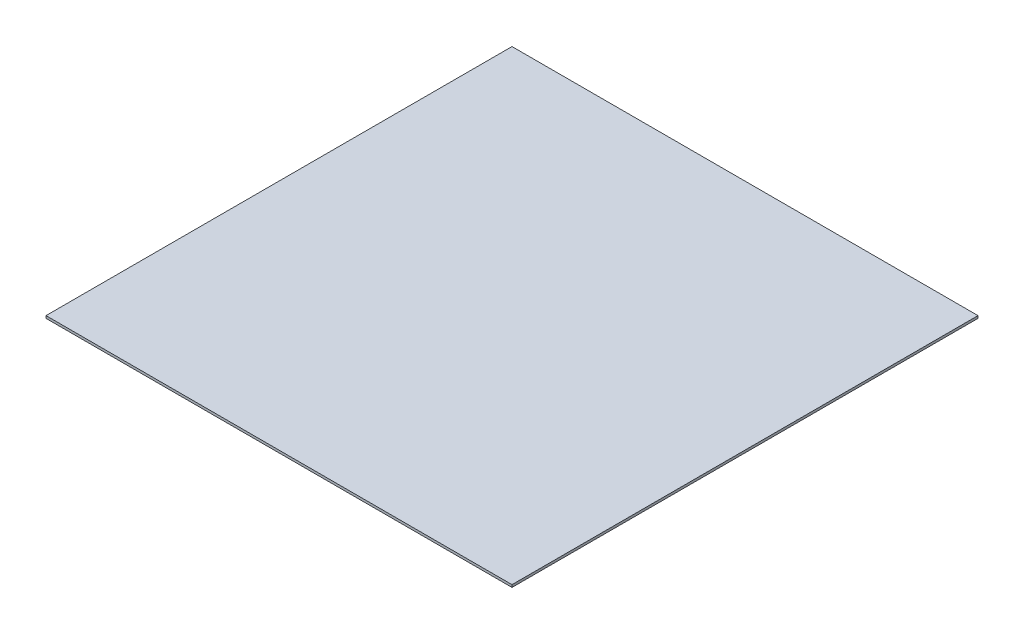
ISO-10303-21;
HEADER;
FILE_DESCRIPTION(('STEP AP214'),'2;1');
FILE_NAME('part.step','',(''),(''),'','','');
FILE_SCHEMA(('AUTOMOTIVE_DESIGN { 1 0 10303 214 1 1 1 1 }'));
ENDSEC;
DATA;
#1=APPLICATION_CONTEXT('core data for automotive mechanical design processes');
#2=APPLICATION_PROTOCOL_DEFINITION('international standard','automotive_design',2000,#1);
#3=PRODUCT_CONTEXT('',#1,'mechanical');
#4=PRODUCT('Part','Part','',(#3));
#5=PRODUCT_RELATED_PRODUCT_CATEGORY('part','',(#4));
#6=PRODUCT_DEFINITION_FORMATION('','',#4);
#7=PRODUCT_DEFINITION_CONTEXT('part definition',#1,'design');
#8=PRODUCT_DEFINITION('design','',#6,#7);
#9=PRODUCT_DEFINITION_SHAPE('','',#8);
#10=(LENGTH_UNIT() NAMED_UNIT(*) SI_UNIT(.MILLI.,.METRE.));
#11=(NAMED_UNIT(*) PLANE_ANGLE_UNIT() SI_UNIT($,.RADIAN.));
#12=(NAMED_UNIT(*) SI_UNIT($,.STERADIAN.) SOLID_ANGLE_UNIT());
#13=UNCERTAINTY_MEASURE_WITH_UNIT(LENGTH_MEASURE(1.E-05),#10,'distance_accuracy_value','');
#14=(GEOMETRIC_REPRESENTATION_CONTEXT(3) GLOBAL_UNCERTAINTY_ASSIGNED_CONTEXT((#13)) GLOBAL_UNIT_ASSIGNED_CONTEXT((#10,
#11,#12)) REPRESENTATION_CONTEXT('',''));
#15=CARTESIAN_POINT('',(0.,0.,0.));
#16=DIRECTION('',(0.,0.,1.));
#17=DIRECTION('',(1.,0.,0.));
#18=AXIS2_PLACEMENT_3D('',#15,#16,#17);
#19=CARTESIAN_POINT('',(304.8,3.175,-304.8));
#20=DIRECTION('',(-1.,0.,0.));
#21=DIRECTION('',(0.,0.,1.));
#22=AXIS2_PLACEMENT_3D('',#19,#20,#21);
#23=PLANE('',#22);
#24=DIRECTION('',(0.,0.,-1.));
#25=VECTOR('',#24,1.);
#26=CARTESIAN_POINT('',(304.8,0.,-304.8));
#27=LINE('',#26,#25);
#28=CARTESIAN_POINT('',(304.8,0.,304.8));
#29=VERTEX_POINT('',#28);
#30=CARTESIAN_POINT('',(304.8,0.,-304.8));
#31=VERTEX_POINT('',#30);
#32=EDGE_CURVE('E107',#29,#31,#27,.T.);
#33=ORIENTED_EDGE('',*,*,#32,.T.);
#34=DIRECTION('',(0.,-1.,0.));
#35=VECTOR('',#34,1.);
#36=CARTESIAN_POINT('',(304.8,3.175,-304.8));
#37=LINE('',#36,#35);
#38=CARTESIAN_POINT('',(304.8,3.175,-304.8));
#39=VERTEX_POINT('',#38);
#40=EDGE_CURVE('E11',#39,#31,#37,.T.);
#41=ORIENTED_EDGE('',*,*,#40,.F.);
#42=DIRECTION('',(0.,0.,-1.));
#43=VECTOR('',#42,1.);
#44=CARTESIAN_POINT('',(304.8,3.175,-304.8));
#45=LINE('',#44,#43);
#46=CARTESIAN_POINT('',(304.8,3.175,304.8));
#47=VERTEX_POINT('',#46);
#48=EDGE_CURVE('E91',#47,#39,#45,.T.);
#49=ORIENTED_EDGE('',*,*,#48,.F.);
#50=DIRECTION('',(0.,-1.,0.));
#51=VECTOR('',#50,1.);
#52=CARTESIAN_POINT('',(304.8,3.175,304.8));
#53=LINE('',#52,#51);
#54=EDGE_CURVE('E103',#47,#29,#53,.T.);
#55=ORIENTED_EDGE('',*,*,#54,.T.);
#56=EDGE_LOOP('',(#33,#41,#49,#55));
#57=FACE_BOUND('',#56,.T.);
#58=ADVANCED_FACE('F39',(#57),#23,.F.);
#59=CARTESIAN_POINT('',(-304.8,3.175,-304.8));
#60=DIRECTION('',(0.,0.,1.));
#61=DIRECTION('',(1.,0.,0.));
#62=AXIS2_PLACEMENT_3D('',#59,#60,#61);
#63=PLANE('',#62);
#64=DIRECTION('',(-1.,0.,0.));
#65=VECTOR('',#64,1.);
#66=CARTESIAN_POINT('',(-304.8,0.,-304.8));
#67=LINE('',#66,#65);
#68=CARTESIAN_POINT('',(-304.8,0.,-304.8));
#69=VERTEX_POINT('',#68);
#70=EDGE_CURVE('E96',#31,#69,#67,.T.);
#71=ORIENTED_EDGE('',*,*,#70,.T.);
#72=DIRECTION('',(0.,-1.,0.));
#73=VECTOR('',#72,1.);
#74=CARTESIAN_POINT('',(-304.8,3.175,-304.8));
#75=LINE('',#74,#73);
#76=CARTESIAN_POINT('',(-304.8,3.175,-304.8));
#77=VERTEX_POINT('',#76);
#78=EDGE_CURVE('E48',#77,#69,#75,.T.);
#79=ORIENTED_EDGE('',*,*,#78,.F.);
#80=DIRECTION('',(-1.,0.,0.));
#81=VECTOR('',#80,1.);
#82=CARTESIAN_POINT('',(-304.8,3.175,-304.8));
#83=LINE('',#82,#81);
#84=EDGE_CURVE('E86',#39,#77,#83,.T.);
#85=ORIENTED_EDGE('',*,*,#84,.F.);
#86=ORIENTED_EDGE('',*,*,#40,.T.);
#87=EDGE_LOOP('',(#71,#79,#85,#86));
#88=FACE_BOUND('',#87,.T.);
#89=ADVANCED_FACE('F95',(#88),#63,.F.);
#90=CARTESIAN_POINT('',(-304.8,3.175,-304.8));
#91=DIRECTION('',(1.,0.,0.));
#92=DIRECTION('',(0.,0.,-1.));
#93=AXIS2_PLACEMENT_3D('',#90,#91,#92);
#94=PLANE('',#93);
#95=DIRECTION('',(0.,0.,1.));
#96=VECTOR('',#95,1.);
#97=CARTESIAN_POINT('',(-304.8,0.,-304.8));
#98=LINE('',#97,#96);
#99=CARTESIAN_POINT('',(-304.8,0.,304.8));
#100=VERTEX_POINT('',#99);
#101=EDGE_CURVE('E73',#69,#100,#98,.T.);
#102=ORIENTED_EDGE('',*,*,#101,.T.);
#103=DIRECTION('',(0.,-1.,0.));
#104=VECTOR('',#103,1.);
#105=CARTESIAN_POINT('',(-304.8,3.175,304.8));
#106=LINE('',#105,#104);
#107=CARTESIAN_POINT('',(-304.8,3.175,304.8));
#108=VERTEX_POINT('',#107);
#109=EDGE_CURVE('E98',#108,#100,#106,.T.);
#110=ORIENTED_EDGE('',*,*,#109,.F.);
#111=DIRECTION('',(0.,0.,1.));
#112=VECTOR('',#111,1.);
#113=CARTESIAN_POINT('',(-304.8,3.175,-304.8));
#114=LINE('',#113,#112);
#115=EDGE_CURVE('E89',#77,#108,#114,.T.);
#116=ORIENTED_EDGE('',*,*,#115,.F.);
#117=ORIENTED_EDGE('',*,*,#78,.T.);
#118=EDGE_LOOP('',(#102,#110,#116,#117));
#119=FACE_BOUND('',#118,.T.);
#120=ADVANCED_FACE('F99',(#119),#94,.F.);
#121=CARTESIAN_POINT('',(-304.8,3.175,304.8));
#122=DIRECTION('',(0.,0.,-1.));
#123=DIRECTION('',(-1.,0.,0.));
#124=AXIS2_PLACEMENT_3D('',#121,#122,#123);
#125=PLANE('',#124);
#126=DIRECTION('',(1.,0.,0.));
#127=VECTOR('',#126,1.);
#128=CARTESIAN_POINT('',(-304.8,0.,304.8));
#129=LINE('',#128,#127);
#130=EDGE_CURVE('E79',#100,#29,#129,.T.);
#131=ORIENTED_EDGE('',*,*,#130,.T.);
#132=ORIENTED_EDGE('',*,*,#54,.F.);
#133=DIRECTION('',(1.,0.,0.));
#134=VECTOR('',#133,1.);
#135=CARTESIAN_POINT('',(-304.8,3.175,304.8));
#136=LINE('',#135,#134);
#137=EDGE_CURVE('E56',#108,#47,#136,.T.);
#138=ORIENTED_EDGE('',*,*,#137,.F.);
#139=ORIENTED_EDGE('',*,*,#109,.T.);
#140=EDGE_LOOP('',(#131,#132,#138,#139));
#141=FACE_BOUND('',#140,.T.);
#142=ADVANCED_FACE('F120',(#141),#125,.F.);
#143=CARTESIAN_POINT('',(0.,3.175,0.));
#144=DIRECTION('',(0.,1.,0.));
#145=DIRECTION('',(0.,0.,1.));
#146=AXIS2_PLACEMENT_3D('',#143,#144,#145);
#147=PLANE('',#146);
#148=ORIENTED_EDGE('',*,*,#48,.T.);
#149=ORIENTED_EDGE('',*,*,#84,.T.);
#150=ORIENTED_EDGE('',*,*,#115,.T.);
#151=ORIENTED_EDGE('',*,*,#137,.T.);
#152=EDGE_LOOP('',(#148,#149,#150,#151));
#153=FACE_BOUND('',#152,.T.);
#154=ADVANCED_FACE('F87',(#153),#147,.T.);
#155=CARTESIAN_POINT('',(0.,0.,0.));
#156=DIRECTION('',(0.,1.,0.));
#157=DIRECTION('',(0.,0.,1.));
#158=AXIS2_PLACEMENT_3D('',#155,#156,#157);
#159=PLANE('',#158);
#160=ORIENTED_EDGE('',*,*,#32,.F.);
#161=ORIENTED_EDGE('',*,*,#130,.F.);
#162=ORIENTED_EDGE('',*,*,#101,.F.);
#163=ORIENTED_EDGE('',*,*,#70,.F.);
#164=EDGE_LOOP('',(#160,#161,#162,#163));
#165=FACE_BOUND('',#164,.T.);
#166=ADVANCED_FACE('F123',(#165),#159,.F.);
#167=CLOSED_SHELL('',(#58,#89,#120,#142,#154,#166));
#168=MANIFOLD_SOLID_BREP('B2',#167);
#169=ADVANCED_BREP_SHAPE_REPRESENTATION('',(#18,#168),#14);
#170=SHAPE_DEFINITION_REPRESENTATION(#9,#169);
ENDSEC;
END-ISO-10303-21;
